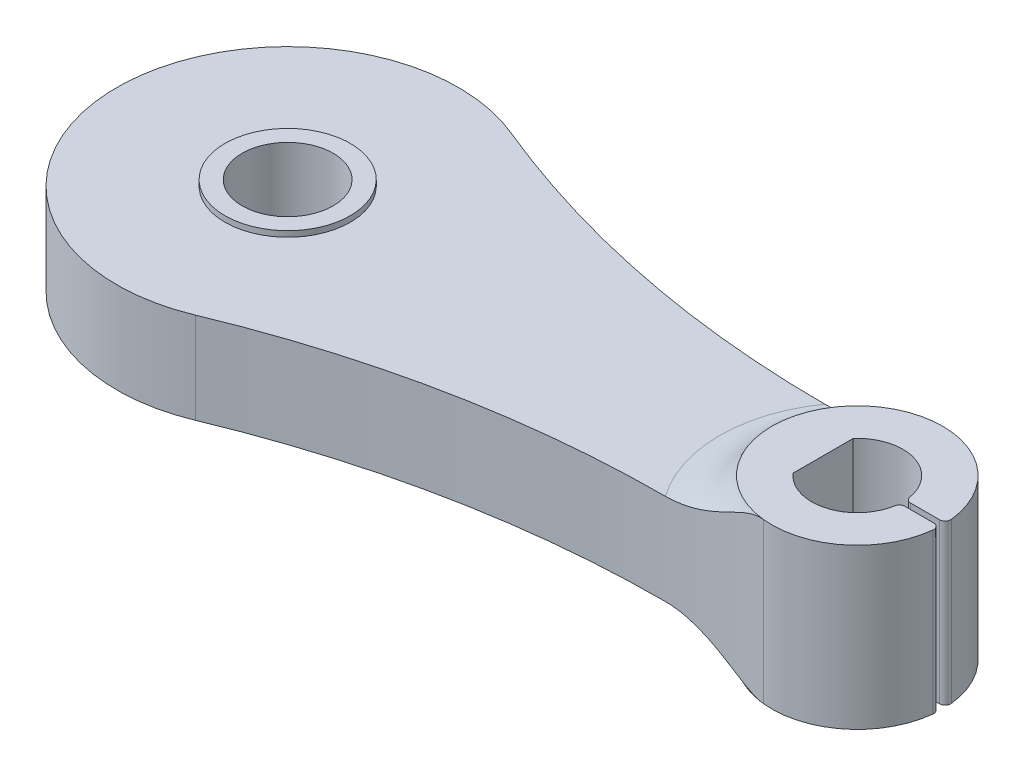
ISO-10303-21;
HEADER;
FILE_DESCRIPTION(('STEP AP214'),'2;1');
FILE_NAME('part.step','',(''),(''),'','','');
FILE_SCHEMA(('AUTOMOTIVE_DESIGN { 1 0 10303 214 1 1 1 1 }'));
ENDSEC;
DATA;
#1=APPLICATION_CONTEXT('core data for automotive mechanical design processes');
#2=APPLICATION_PROTOCOL_DEFINITION('international standard','automotive_design',2000,#1);
#3=PRODUCT_CONTEXT('',#1,'mechanical');
#4=PRODUCT('Part','Part','',(#3));
#5=PRODUCT_RELATED_PRODUCT_CATEGORY('part','',(#4));
#6=PRODUCT_DEFINITION_FORMATION('','',#4);
#7=PRODUCT_DEFINITION_CONTEXT('part definition',#1,'design');
#8=PRODUCT_DEFINITION('design','',#6,#7);
#9=PRODUCT_DEFINITION_SHAPE('','',#8);
#10=(LENGTH_UNIT() NAMED_UNIT(*) SI_UNIT(.MILLI.,.METRE.));
#11=(NAMED_UNIT(*) PLANE_ANGLE_UNIT() SI_UNIT($,.RADIAN.));
#12=(NAMED_UNIT(*) SI_UNIT($,.STERADIAN.) SOLID_ANGLE_UNIT());
#13=UNCERTAINTY_MEASURE_WITH_UNIT(LENGTH_MEASURE(1.E-05),#10,'distance_accuracy_value','');
#14=(GEOMETRIC_REPRESENTATION_CONTEXT(3) GLOBAL_UNCERTAINTY_ASSIGNED_CONTEXT((#13)) GLOBAL_UNIT_ASSIGNED_CONTEXT((#10,
#11,#12)) REPRESENTATION_CONTEXT('',''));
#15=CARTESIAN_POINT('',(0.,0.,0.));
#16=DIRECTION('',(0.,0.,1.));
#17=DIRECTION('',(1.,0.,0.));
#18=AXIS2_PLACEMENT_3D('',#15,#16,#17);
#19=CARTESIAN_POINT('',(50.,4.,0.));
#20=DIRECTION('',(0.,-1.,0.));
#21=DIRECTION('',(0.,0.,-1.));
#22=AXIS2_PLACEMENT_3D('',#19,#20,#21);
#23=CYLINDRICAL_SURFACE('',#22,7.5);
#24=CARTESIAN_POINT('',(50.,7.,0.));
#25=DIRECTION('',(0.,1.,0.));
#26=DIRECTION('',(0.,0.,1.));
#27=AXIS2_PLACEMENT_3D('',#24,#25,#26);
#28=CIRCLE('',#27,7.5);
#29=CARTESIAN_POINT('',(57.4568272716474,7.,-0.803571428571429));
#30=VERTEX_POINT('',#29);
#31=CARTESIAN_POINT('',(49.2404701433393,7.,-7.461441844365));
#32=VERTEX_POINT('',#31);
#33=EDGE_CURVE('E219',#30,#32,#28,.T.);
#34=ORIENTED_EDGE('',*,*,#33,.F.);
#35=DIRECTION('',(0.,-1.,0.));
#36=VECTOR('',#35,1.);
#37=CARTESIAN_POINT('',(57.4568272716474,4.,-0.803571428571429));
#38=LINE('',#37,#36);
#39=CARTESIAN_POINT('',(57.4568272716474,-7.,-0.803571428571429));
#40=VERTEX_POINT('',#39);
#41=EDGE_CURVE('E13',#30,#40,#38,.T.);
#42=ORIENTED_EDGE('',*,*,#41,.T.);
#43=CARTESIAN_POINT('',(50.,-7.,0.));
#44=DIRECTION('',(0.,1.,0.));
#45=DIRECTION('',(0.,0.,1.));
#46=AXIS2_PLACEMENT_3D('',#43,#44,#45);
#47=CIRCLE('',#46,7.5);
#48=CARTESIAN_POINT('',(49.2404701433393,-7.,-7.461441844365));
#49=VERTEX_POINT('',#48);
#50=EDGE_CURVE('E243',#49,#40,#47,.F.);
#51=ORIENTED_EDGE('',*,*,#50,.F.);
#52=DIRECTION('',(0.,-1.,0.));
#53=VECTOR('',#52,1.);
#54=CARTESIAN_POINT('',(49.2404701433393,4.,-7.461441844365));
#55=LINE('',#54,#53);
#56=EDGE_CURVE('E278',#32,#49,#55,.T.);
#57=ORIENTED_EDGE('',*,*,#56,.F.);
#58=EDGE_LOOP('',(#34,#42,#51,#57));
#59=FACE_BOUND('',#58,.T.);
#60=ADVANCED_FACE('F85',(#59),#23,.T.);
#61=CARTESIAN_POINT('',(50.,7.,0.));
#62=DIRECTION('',(0.,1.,0.));
#63=DIRECTION('',(0.,0.,1.));
#64=AXIS2_PLACEMENT_3D('',#61,#62,#63);
#65=PLANE('',#64);
#66=DIRECTION('',(1.,0.,0.));
#67=VECTOR('',#66,1.);
#68=CARTESIAN_POINT('',(53.1100169398287,7.,0.25));
#69=LINE('',#68,#67);
#70=CARTESIAN_POINT('',(54.4370598373247,7.,0.25));
#71=VERTEX_POINT('',#70);
#72=CARTESIAN_POINT('',(56.9597054535375,7.,0.25));
#73=VERTEX_POINT('',#72);
#74=EDGE_CURVE('E436',#71,#73,#69,.T.);
#75=ORIENTED_EDGE('',*,*,#74,.F.);
#76=CARTESIAN_POINT('',(54.4370598373247,7.,0.75));
#77=DIRECTION('',(0.,1.,0.));
#78=DIRECTION('',(0.,0.,1.));
#79=AXIS2_PLACEMENT_3D('',#76,#77,#78);
#80=CIRCLE('',#79,0.5);
#81=CARTESIAN_POINT('',(53.9440531887331,7.,0.666666666666667));
#82=VERTEX_POINT('',#81);
#83=EDGE_CURVE('E223',#71,#82,#80,.T.);
#84=ORIENTED_EDGE('',*,*,#83,.T.);
#85=CARTESIAN_POINT('',(50.,7.,0.));
#86=DIRECTION('',(0.,1.,0.));
#87=DIRECTION('',(0.,0.,1.));
#88=AXIS2_PLACEMENT_3D('',#85,#86,#87);
#89=CIRCLE('',#88,4.);
#90=CARTESIAN_POINT('',(47.,7.,2.64575131106458));
#91=VERTEX_POINT('',#90);
#92=EDGE_CURVE('E203',#91,#82,#89,.T.);
#93=ORIENTED_EDGE('',*,*,#92,.F.);
#94=DIRECTION('',(0.,0.,1.));
#95=VECTOR('',#94,1.);
#96=CARTESIAN_POINT('',(47.,7.,-2.64575131106458));
#97=LINE('',#96,#95);
#98=CARTESIAN_POINT('',(47.,7.,-2.64575131106458));
#99=VERTEX_POINT('',#98);
#100=EDGE_CURVE('E215',#99,#91,#97,.T.);
#101=ORIENTED_EDGE('',*,*,#100,.F.);
#102=CARTESIAN_POINT('',(53.9440531887331,7.,-0.666666666666667));
#103=VERTEX_POINT('',#102);
#104=EDGE_CURVE('E224',#103,#99,#89,.T.);
#105=ORIENTED_EDGE('',*,*,#104,.F.);
#106=CARTESIAN_POINT('',(54.4370598373247,7.,-0.75));
#107=DIRECTION('',(0.,1.,0.));
#108=DIRECTION('',(0.,0.,1.));
#109=AXIS2_PLACEMENT_3D('',#106,#107,#108);
#110=CIRCLE('',#109,0.5);
#111=CARTESIAN_POINT('',(54.4370598373247,7.,-0.25));
#112=VERTEX_POINT('',#111);
#113=EDGE_CURVE('E427',#103,#112,#110,.T.);
#114=ORIENTED_EDGE('',*,*,#113,.T.);
#115=DIRECTION('',(1.,0.,0.));
#116=VECTOR('',#115,1.);
#117=CARTESIAN_POINT('',(53.1100169398287,7.,-0.25));
#118=LINE('',#117,#116);
#119=CARTESIAN_POINT('',(56.9597054535375,7.,-0.25));
#120=VERTEX_POINT('',#119);
#121=EDGE_CURVE('E439',#112,#120,#118,.T.);
#122=ORIENTED_EDGE('',*,*,#121,.T.);
#123=CARTESIAN_POINT('',(56.9597054535375,7.,-0.75));
#124=DIRECTION('',(0.,1.,0.));
#125=DIRECTION('',(0.,0.,1.));
#126=AXIS2_PLACEMENT_3D('',#123,#124,#125);
#127=CIRCLE('',#126,0.5);
#128=EDGE_CURVE('E430',#120,#30,#127,.T.);
#129=ORIENTED_EDGE('',*,*,#128,.T.);
#130=ORIENTED_EDGE('',*,*,#33,.T.);
#131=CARTESIAN_POINT('',(49.2404701433393,7.,7.461441844365));
#132=VERTEX_POINT('',#131);
#133=EDGE_CURVE('E230',#32,#132,#28,.T.);
#134=ORIENTED_EDGE('',*,*,#133,.T.);
#135=CARTESIAN_POINT('',(57.4568272716474,7.,0.80357142857143));
#136=VERTEX_POINT('',#135);
#137=EDGE_CURVE('E234',#132,#136,#28,.T.);
#138=ORIENTED_EDGE('',*,*,#137,.T.);
#139=CARTESIAN_POINT('',(56.9597054535375,7.,0.75));
#140=DIRECTION('',(0.,1.,0.));
#141=DIRECTION('',(0.,0.,1.));
#142=AXIS2_PLACEMENT_3D('',#139,#140,#141);
#143=CIRCLE('',#142,0.5);
#144=EDGE_CURVE('E407',#136,#73,#143,.T.);
#145=ORIENTED_EDGE('',*,*,#144,.T.);
#146=EDGE_LOOP('',(#75,#84,#93,#101,#105,#114,#122,#129,#130,#134,#138,#145));
#147=FACE_BOUND('',#146,.T.);
#148=ADVANCED_FACE('F222',(#147),#65,.T.);
#149=CARTESIAN_POINT('',(0.,-7.,0.));
#150=DIRECTION('',(0.,1.,0.));
#151=DIRECTION('',(0.,0.,1.));
#152=AXIS2_PLACEMENT_3D('',#149,#150,#151);
#153=PLANE('',#152);
#154=CARTESIAN_POINT('',(50.,-7.,0.));
#155=DIRECTION('',(0.,1.,0.));
#156=DIRECTION('',(0.,0.,1.));
#157=AXIS2_PLACEMENT_3D('',#154,#155,#156);
#158=CIRCLE('',#157,4.);
#159=CARTESIAN_POINT('',(53.9440531887331,-7.,0.666666666666667));
#160=VERTEX_POINT('',#159);
#161=CARTESIAN_POINT('',(47.,-7.,2.64575131106458));
#162=VERTEX_POINT('',#161);
#163=EDGE_CURVE('E206',#160,#162,#158,.F.);
#164=ORIENTED_EDGE('',*,*,#163,.F.);
#165=CARTESIAN_POINT('',(54.4370598373247,-7.,0.75));
#166=DIRECTION('',(0.,1.,0.));
#167=DIRECTION('',(0.,0.,1.));
#168=AXIS2_PLACEMENT_3D('',#165,#166,#167);
#169=CIRCLE('',#168,0.5);
#170=CARTESIAN_POINT('',(54.4370598373247,-7.,0.25));
#171=VERTEX_POINT('',#170);
#172=EDGE_CURVE('E417',#160,#171,#169,.F.);
#173=ORIENTED_EDGE('',*,*,#172,.T.);
#174=DIRECTION('',(1.,0.,0.));
#175=VECTOR('',#174,1.);
#176=CARTESIAN_POINT('',(0.,-7.,0.25));
#177=LINE('',#176,#175);
#178=CARTESIAN_POINT('',(56.9597054535375,-7.,0.25));
#179=VERTEX_POINT('',#178);
#180=EDGE_CURVE('E435',#171,#179,#177,.T.);
#181=ORIENTED_EDGE('',*,*,#180,.T.);
#182=CARTESIAN_POINT('',(56.9597054535375,-7.,0.75));
#183=DIRECTION('',(0.,1.,0.));
#184=DIRECTION('',(0.,0.,1.));
#185=AXIS2_PLACEMENT_3D('',#182,#183,#184);
#186=CIRCLE('',#185,0.5);
#187=CARTESIAN_POINT('',(57.4568272716474,-7.,0.80357142857143));
#188=VERTEX_POINT('',#187);
#189=EDGE_CURVE('E106',#179,#188,#186,.F.);
#190=ORIENTED_EDGE('',*,*,#189,.T.);
#191=CARTESIAN_POINT('',(49.2404701433393,-7.,7.461441844365));
#192=VERTEX_POINT('',#191);
#193=EDGE_CURVE('E238',#188,#192,#47,.F.);
#194=ORIENTED_EDGE('',*,*,#193,.T.);
#195=EDGE_CURVE('E239',#192,#49,#47,.F.);
#196=ORIENTED_EDGE('',*,*,#195,.T.);
#197=ORIENTED_EDGE('',*,*,#50,.T.);
#198=CARTESIAN_POINT('',(56.9597054535375,-7.,-0.75));
#199=DIRECTION('',(0.,1.,0.));
#200=DIRECTION('',(0.,0.,1.));
#201=AXIS2_PLACEMENT_3D('',#198,#199,#200);
#202=CIRCLE('',#201,0.5);
#203=CARTESIAN_POINT('',(56.9597054535375,-7.,-0.25));
#204=VERTEX_POINT('',#203);
#205=EDGE_CURVE('E422',#40,#204,#202,.F.);
#206=ORIENTED_EDGE('',*,*,#205,.T.);
#207=DIRECTION('',(1.,0.,0.));
#208=VECTOR('',#207,1.);
#209=CARTESIAN_POINT('',(0.,-7.,-0.25));
#210=LINE('',#209,#208);
#211=CARTESIAN_POINT('',(54.4370598373247,-7.,-0.25));
#212=VERTEX_POINT('',#211);
#213=EDGE_CURVE('E226',#212,#204,#210,.T.);
#214=ORIENTED_EDGE('',*,*,#213,.F.);
#215=CARTESIAN_POINT('',(54.4370598373247,-7.,-0.75));
#216=DIRECTION('',(0.,1.,0.));
#217=DIRECTION('',(0.,0.,1.));
#218=AXIS2_PLACEMENT_3D('',#215,#216,#217);
#219=CIRCLE('',#218,0.5);
#220=CARTESIAN_POINT('',(53.9440531887331,-7.,-0.666666666666667));
#221=VERTEX_POINT('',#220);
#222=EDGE_CURVE('E419',#212,#221,#219,.F.);
#223=ORIENTED_EDGE('',*,*,#222,.T.);
#224=CARTESIAN_POINT('',(47.,-7.,-2.64575131106458));
#225=VERTEX_POINT('',#224);
#226=EDGE_CURVE('E235',#225,#221,#158,.F.);
#227=ORIENTED_EDGE('',*,*,#226,.F.);
#228=DIRECTION('',(0.,0.,-1.));
#229=VECTOR('',#228,1.);
#230=CARTESIAN_POINT('',(47.,-7.,-2.64575131106458));
#231=LINE('',#230,#229);
#232=EDGE_CURVE('E233',#162,#225,#231,.T.);
#233=ORIENTED_EDGE('',*,*,#232,.F.);
#234=EDGE_LOOP('',(#164,#173,#181,#190,#194,#196,#197,#206,#214,#223,#227,#233));
#235=FACE_BOUND('',#234,.T.);
#236=ADVANCED_FACE('F376',(#235),#153,.F.);
#237=CARTESIAN_POINT('',(50.,4.,0.));
#238=DIRECTION('',(0.,-1.,0.));
#239=DIRECTION('',(0.,0.,-1.));
#240=AXIS2_PLACEMENT_3D('',#237,#238,#239);
#241=CYLINDRICAL_SURFACE('',#240,4.00000000000001);
#242=ORIENTED_EDGE('',*,*,#226,.T.);
#243=DIRECTION('',(0.,-1.,0.));
#244=VECTOR('',#243,1.);
#245=CARTESIAN_POINT('',(53.9440531887331,4.,-0.666666666666667));
#246=LINE('',#245,#244);
#247=EDGE_CURVE('E414',#221,#103,#246,.F.);
#248=ORIENTED_EDGE('',*,*,#247,.T.);
#249=ORIENTED_EDGE('',*,*,#104,.T.);
#250=DIRECTION('',(0.,-1.,0.));
#251=VECTOR('',#250,1.);
#252=CARTESIAN_POINT('',(47.,4.,-2.64575131106458));
#253=LINE('',#252,#251);
#254=EDGE_CURVE('E211',#99,#225,#253,.T.);
#255=ORIENTED_EDGE('',*,*,#254,.T.);
#256=EDGE_LOOP('',(#242,#248,#249,#255));
#257=FACE_BOUND('',#256,.T.);
#258=ADVANCED_FACE('F379',(#257),#241,.F.);
#259=CARTESIAN_POINT('',(40.1508533778099,4.,96.7556891853994));
#260=DIRECTION('',(0.,-1.,0.));
#261=DIRECTION('',(0.,0.,-1.));
#262=AXIS2_PLACEMENT_3D('',#259,#260,#261);
#263=CYLINDRICAL_SURFACE('',#262,89.7556891853994);
#264=CARTESIAN_POINT('',(40.1508533778099,-4.,96.7556891853994));
#265=DIRECTION('',(0.,1.,0.));
#266=DIRECTION('',(0.,0.,1.));
#267=AXIS2_PLACEMENT_3D('',#264,#265,#266);
#268=CIRCLE('',#267,89.7556891853994);
#269=CARTESIAN_POINT('',(5.74921329190292,-4.,13.8544774901188));
#270=VERTEX_POINT('',#269);
#271=CARTESIAN_POINT('',(40.1517191669877,-4.,7.00000000417574));
#272=VERTEX_POINT('',#271);
#273=EDGE_CURVE('E272',#270,#272,#268,.F.);
#274=ORIENTED_EDGE('',*,*,#273,.T.);
#275=CARTESIAN_POINT('',(40.1517191669877,-4.,7.00000000417574));
#276=CARTESIAN_POINT('',(40.3650739280543,-3.99998503275693,6.99999647142615));
#277=CARTESIAN_POINT('',(40.5782977550911,-4.00906843364892,7.00076461168083));
#278=CARTESIAN_POINT('',(41.0030923892395,-4.04381030799842,7.00379668554938));
#279=CARTESIAN_POINT('',(41.2146651256413,-4.06944503675984,7.00605847646331));
#280=CARTESIAN_POINT('',(41.6321886862055,-4.13517408905288,7.0119852020642));
#281=CARTESIAN_POINT('',(41.8381760920268,-4.17504289964192,7.01562830528915));
#282=CARTESIAN_POINT('',(42.2472408374918,-4.26773557172542,7.0242523230979));
#283=CARTESIAN_POINT('',(42.4503169771821,-4.32056462133828,7.02923377351217));
#284=CARTESIAN_POINT('',(42.9354776413249,-4.46153878780631,7.04275704664601));
#285=CARTESIAN_POINT('',(43.2159129079021,-4.55529152276407,7.0519218014944));
#286=CARTESIAN_POINT('',(43.769891201506,-4.76099989290752,7.07256237914839));
#287=CARTESIAN_POINT('',(44.0434326443113,-4.87295966885728,7.08403872781374));
#288=CARTESIAN_POINT('',(44.4505072988947,-5.05176511093903,7.10294014692083));
#289=CARTESIAN_POINT('',(44.5863546029285,-5.1135266603868,7.10956053678141));
#290=CARTESIAN_POINT('',(44.8566788620384,-5.23992240111426,7.12334419432614));
#291=CARTESIAN_POINT('',(44.9911558235828,-5.3045565788267,7.13050745944644));
#292=CARTESIAN_POINT('',(45.2589511078463,-5.43601550058074,7.14537136250217));
#293=CARTESIAN_POINT('',(45.3922697457493,-5.50283962350754,7.15307184875788));
#294=CARTESIAN_POINT('',(45.6581339424304,-5.63795589812568,7.16901979195326));
#295=CARTESIAN_POINT('',(45.7906794630253,-5.70624812155694,7.17726727566367));
#296=CARTESIAN_POINT('',(46.1116581745025,-5.87258996652346,7.19795191607988));
#297=CARTESIAN_POINT('',(46.2999073458346,-5.97095356887168,7.21068021829658));
#298=CARTESIAN_POINT('',(46.6773191715987,-6.16572942484526,7.23739604025662));
#299=CARTESIAN_POINT('',(46.866481689119,-6.26214196033846,7.25138337649531));
#300=CARTESIAN_POINT('',(47.1513283070787,-6.40097006138974,7.27336713174549));
#301=CARTESIAN_POINT('',(47.2457804375966,-6.44597868107352,7.28080539074634));
#302=CARTESIAN_POINT('',(47.4358112160235,-6.53346823427619,7.29607693498163));
#303=CARTESIAN_POINT('',(47.5313897156674,-6.57594949611798,7.30391016866054));
#304=CARTESIAN_POINT('',(47.7239107017401,-6.65728708031997,7.32000357366688));
#305=CARTESIAN_POINT('',(47.8208512735616,-6.6961479994534,7.32826318231673));
#306=CARTESIAN_POINT('',(48.0165052969247,-6.76895412849709,7.34525971761691));
#307=CARTESIAN_POINT('',(48.1152179996207,-6.8029013622599,7.35399644569702));
#308=CARTESIAN_POINT('',(48.297309022167,-6.85893311454157,7.37042283913619));
#309=CARTESIAN_POINT('',(48.3803725029214,-6.88205394162226,7.37803076775633));
#310=CARTESIAN_POINT('',(48.5477817432871,-6.92281742404677,7.39360325829335));
#311=CARTESIAN_POINT('',(48.6321269130575,-6.94046252377719,7.40156765925747));
#312=CARTESIAN_POINT('',(48.8033831549215,-6.96953700054271,7.41798731126782));
#313=CARTESIAN_POINT('',(48.8903133469269,-6.98085305952041,7.42644868623633));
#314=CARTESIAN_POINT('',(49.0649717206972,-6.99613632846145,7.44370785249643));
#315=CARTESIAN_POINT('',(49.1527012452191,-7.00008717455953,7.45250634867476));
#316=CARTESIAN_POINT('',(49.2404701433399,-6.99999999999805,7.46144184436505));
#317=B_SPLINE_CURVE_WITH_KNOTS('',3,(#275,#276,#277,#278,#279,#280,#281,#282,#283,#284,#285,
#286,#287,#288,#289,#290,#291,#292,#293,#294,#295,#296,#297,#298,#299,#300,#301,#302,#303,#304,
#305,#306,#307,#308,#309,#310,#311,#312,#313,#314,#315,#316),.UNSPECIFIED.,.F.,.F.,(4,2,2,2,2,2,
2,2,2,2,2,2,2,2,2,2,2,2,2,2,4),(0.,0.639679250589893,1.27844284402577,1.907505427642,
2.53682024364053,3.42347356971667,4.31032882701087,4.75842485064685,5.20651875817666,
5.65448665833767,6.10247649879717,6.74082449304405,7.37907959803649,7.69372968461154,
8.00833880610101,8.32254286092008,8.6366171306064,8.89613517007863,9.1555371924534,
9.41944605850914,9.68394057577045),.UNSPECIFIED.);
#318=EDGE_CURVE('E295',#272,#192,#317,.T.);
#319=ORIENTED_EDGE('',*,*,#318,.T.);
#320=DIRECTION('',(0.,-1.,0.));
#321=VECTOR('',#320,1.);
#322=CARTESIAN_POINT('',(49.2404701433393,4.,7.461441844365));
#323=LINE('',#322,#321);
#324=EDGE_CURVE('E280',#132,#192,#323,.T.);
#325=ORIENTED_EDGE('',*,*,#324,.F.);
#326=CARTESIAN_POINT('',(49.2404701433393,7.,7.461441844365));
#327=CARTESIAN_POINT('',(49.1768367899299,7.00002635516338,7.45496400064645));
#328=CARTESIAN_POINT('',(49.1132079905768,6.99796916109737,7.44855603445425));
#329=CARTESIAN_POINT('',(48.986233143627,6.98988800330691,7.435904948171));
#330=CARTESIAN_POINT('',(48.9228869188593,6.98386703488923,7.4296617073042));
#331=CARTESIAN_POINT('',(48.7970862798442,6.9681122212642,7.41739745336572));
#332=CARTESIAN_POINT('',(48.7346287291306,6.95840408036743,7.41137521139327));
#333=CARTESIAN_POINT('',(48.6103138845298,6.93560804057646,7.39951889573062));
#334=CARTESIAN_POINT('',(48.5484566965962,6.92251955597185,7.39368485484718));
#335=CARTESIAN_POINT('',(48.3649281806781,6.87899420267018,7.37656561330168));
#336=CARTESIAN_POINT('',(48.2442631993026,6.84415543639123,7.3655623819291));
#337=CARTESIAN_POINT('',(48.0653511732818,6.78535427825589,7.34960401849969));
#338=CARTESIAN_POINT('',(48.0060047087599,6.76464005202082,7.34437082207437));
#339=CARTESIAN_POINT('',(47.8879718213105,6.72137433246757,7.33407968624382));
#340=CARTESIAN_POINT('',(47.8292853348447,6.69882301776526,7.3290217298684));
#341=CARTESIAN_POINT('',(47.6569613356767,6.63002418402956,7.31433873200418));
#342=CARTESIAN_POINT('',(47.5441593771961,6.58164305739465,7.30494640615866));
#343=CARTESIAN_POINT('',(47.3202492549258,6.48099122364772,7.28672181887767));
#344=CARTESIAN_POINT('',(47.2091415910113,6.42871939440841,7.27788972038977));
#345=CARTESIAN_POINT('',(46.9879874623177,6.32165851956295,7.26071920274946));
#346=CARTESIAN_POINT('',(46.8779420818023,6.26686717576674,7.25238125086125));
#347=CARTESIAN_POINT('',(46.658529154905,6.15587308103594,7.23616066124733));
#348=CARTESIAN_POINT('',(46.5491616478406,6.09967024917078,7.2282780497154));
#349=CARTESIAN_POINT('',(46.2209372557653,5.92996340304524,7.20522244244228));
#350=CARTESIAN_POINT('',(46.0024725676333,5.81562036140222,7.19068154014266));
#351=CARTESIAN_POINT('',(45.5642073702101,5.58961106122677,7.16312555922151));
#352=CARTESIAN_POINT('',(45.3444076862145,5.47794332549786,7.15010962237219));
#353=CARTESIAN_POINT('',(44.9015201964554,5.26057752004962,7.12553729168293));
#354=CARTESIAN_POINT('',(44.6784296744955,5.15488477494529,7.113982188674));
#355=CARTESIAN_POINT('',(44.2280380833404,4.95247003105622,7.09236821950665));
#356=CARTESIAN_POINT('',(44.0007360285272,4.85575016482254,7.08230970869655));
#357=CARTESIAN_POINT('',(43.5418702400517,4.67415799852869,7.0637867955057));
#358=CARTESIAN_POINT('',(43.310315970033,4.58926232135691,7.05531923580595));
#359=CARTESIAN_POINT('',(42.8424411465387,4.43367955112755,7.04006159218146));
#360=CARTESIAN_POINT('',(42.6061220735081,4.36298811738344,7.03327099564643));
#361=CARTESIAN_POINT('',(42.1891531675092,4.25405116410887,7.0229697533448));
#362=CARTESIAN_POINT('',(42.0094766081108,4.21211819829736,7.01906377819895));
#363=CARTESIAN_POINT('',(41.6480048043918,4.13869380839434,7.01230528503545));
#364=CARTESIAN_POINT('',(41.4662100463881,4.10720003463107,7.00945252994069));
#365=CARTESIAN_POINT('',(41.096262028406,4.05504620155602,7.00478401454));
#366=CARTESIAN_POINT('',(40.9080654122836,4.03468530217936,7.00299678276721));
#367=CARTESIAN_POINT('',(40.5305134191938,4.00715013330548,7.00060324155863));
#368=CARTESIAN_POINT('',(40.3411570225091,3.99998991485853,6.99999819041699));
#369=CARTESIAN_POINT('',(40.1517191669877,4.,7.00000000417573));
#370=B_SPLINE_CURVE_WITH_KNOTS('',3,(#326,#327,#328,#329,#330,#331,#332,#333,#334,#335,#336,
#337,#338,#339,#340,#341,#342,#343,#344,#345,#346,#347,#348,#349,#350,#351,#352,#353,#354,#355,
#356,#357,#358,#359,#360,#361,#362,#363,#364,#365,#366,#367,#368,#369),.UNSPECIFIED.,.F.,.F.,(4,
2,2,2,2,2,2,2,2,2,2,2,2,2,2,2,2,2,2,2,2,4),(0.,0.191834809622049,0.383524821508155,
0.573902333311647,0.76431285388432,1.14199462085055,1.33120387878386,1.52039476224281,
1.88956579115715,2.25884370928761,2.62846542039942,2.99810837313607,3.73912555779263,
4.4797236851829,5.22097171724436,5.9623954700802,6.702331920521,7.44204190811849,
7.99540661774157,8.54864669034879,9.11610201838496,9.68416100846899),.UNSPECIFIED.);
#371=CARTESIAN_POINT('',(40.1517191669877,4.,7.00000000417574));
#372=VERTEX_POINT('',#371);
#373=EDGE_CURVE('E332',#132,#372,#370,.T.);
#374=ORIENTED_EDGE('',*,*,#373,.T.);
#375=CARTESIAN_POINT('',(40.1508533778099,4.,96.7556891853994));
#376=DIRECTION('',(0.,1.,0.));
#377=DIRECTION('',(0.,0.,1.));
#378=AXIS2_PLACEMENT_3D('',#375,#376,#377);
#379=CIRCLE('',#378,89.7556891853994);
#380=CARTESIAN_POINT('',(5.74921329190292,4.,13.8544774901188));
#381=VERTEX_POINT('',#380);
#382=EDGE_CURVE('E262',#381,#372,#379,.F.);
#383=ORIENTED_EDGE('',*,*,#382,.F.);
#384=DIRECTION('',(0.,-1.,0.));
#385=VECTOR('',#384,1.);
#386=CARTESIAN_POINT('',(5.74921329190292,4.,13.8544774901188));
#387=LINE('',#386,#385);
#388=EDGE_CURVE('E283',#381,#270,#387,.T.);
#389=ORIENTED_EDGE('',*,*,#388,.T.);
#390=EDGE_LOOP('',(#274,#319,#325,#374,#383,#389));
#391=FACE_BOUND('',#390,.T.);
#392=ADVANCED_FACE('F311',(#391),#263,.F.);
#393=CARTESIAN_POINT('',(40.1508533778099,4.,-96.7556891853994));
#394=DIRECTION('',(0.,-1.,0.));
#395=DIRECTION('',(0.,0.,-1.));
#396=AXIS2_PLACEMENT_3D('',#393,#394,#395);
#397=CYLINDRICAL_SURFACE('',#396,89.7556891853994);
#398=CARTESIAN_POINT('',(40.1508533778099,-4.,-96.7556891853994));
#399=DIRECTION('',(0.,1.,0.));
#400=DIRECTION('',(0.,0.,1.));
#401=AXIS2_PLACEMENT_3D('',#398,#399,#400);
#402=CIRCLE('',#401,89.7556891853994);
#403=CARTESIAN_POINT('',(5.74921329190292,-4.,-13.8544774901188));
#404=VERTEX_POINT('',#403);
#405=CARTESIAN_POINT('',(40.1517191669877,-4.,-7.00000000417574));
#406=VERTEX_POINT('',#405);
#407=EDGE_CURVE('E263',#404,#406,#402,.T.);
#408=ORIENTED_EDGE('',*,*,#407,.F.);
#409=DIRECTION('',(0.,-1.,0.));
#410=VECTOR('',#409,1.);
#411=CARTESIAN_POINT('',(5.74921329190292,4.,-13.8544774901188));
#412=LINE('',#411,#410);
#413=CARTESIAN_POINT('',(5.74921329190292,4.,-13.8544774901188));
#414=VERTEX_POINT('',#413);
#415=EDGE_CURVE('E269',#414,#404,#412,.T.);
#416=ORIENTED_EDGE('',*,*,#415,.F.);
#417=CARTESIAN_POINT('',(40.1508533778099,4.,-96.7556891853994));
#418=DIRECTION('',(0.,1.,0.));
#419=DIRECTION('',(0.,0.,1.));
#420=AXIS2_PLACEMENT_3D('',#417,#418,#419);
#421=CIRCLE('',#420,89.7556891853994);
#422=CARTESIAN_POINT('',(40.1517191669877,4.,-7.00000000417574));
#423=VERTEX_POINT('',#422);
#424=EDGE_CURVE('E266',#414,#423,#421,.T.);
#425=ORIENTED_EDGE('',*,*,#424,.T.);
#426=CARTESIAN_POINT('',(40.1517191669877,4.,-7.00000000417574));
#427=CARTESIAN_POINT('',(40.3650739280543,3.99998503275693,-6.99999647142615));
#428=CARTESIAN_POINT('',(40.5782977550911,4.00906843364892,-7.00076461168083));
#429=CARTESIAN_POINT('',(41.0030923892395,4.04381030799842,-7.00379668554938));
#430=CARTESIAN_POINT('',(41.2146651256413,4.06944503675984,-7.00605847646331));
#431=CARTESIAN_POINT('',(41.6321886862055,4.13517408905288,-7.0119852020642));
#432=CARTESIAN_POINT('',(41.8381760920268,4.17504289964192,-7.01562830528915));
#433=CARTESIAN_POINT('',(42.2472408374918,4.26773557172542,-7.0242523230979));
#434=CARTESIAN_POINT('',(42.4503169771821,4.32056462133828,-7.02923377351217));
#435=CARTESIAN_POINT('',(42.9354776413249,4.46153878780631,-7.04275704664601));
#436=CARTESIAN_POINT('',(43.2159129079021,4.55529152276407,-7.0519218014944));
#437=CARTESIAN_POINT('',(43.769891201506,4.76099989290752,-7.07256237914839));
#438=CARTESIAN_POINT('',(44.0434326443113,4.87295966885728,-7.08403872781374));
#439=CARTESIAN_POINT('',(44.4505072988947,5.05176511093903,-7.10294014692083));
#440=CARTESIAN_POINT('',(44.5863546029285,5.1135266603868,-7.10956053678141));
#441=CARTESIAN_POINT('',(44.8566788620384,5.23992240111426,-7.12334419432614));
#442=CARTESIAN_POINT('',(44.9911558235828,5.3045565788267,-7.13050745944644));
#443=CARTESIAN_POINT('',(45.2589511078463,5.43601550058074,-7.14537136250217));
#444=CARTESIAN_POINT('',(45.3922697457493,5.50283962350754,-7.15307184875788));
#445=CARTESIAN_POINT('',(45.6581339424304,5.63795589812568,-7.16901979195326));
#446=CARTESIAN_POINT('',(45.7906794630253,5.70624812155694,-7.17726727566367));
#447=CARTESIAN_POINT('',(46.1116581745025,5.87258996652346,-7.19795191607987));
#448=CARTESIAN_POINT('',(46.2999073458346,5.97095356887169,-7.21068021829657));
#449=CARTESIAN_POINT('',(46.6773191715986,6.16572942484527,-7.23739604025661));
#450=CARTESIAN_POINT('',(46.866481689119,6.26214196033847,-7.25138337649531));
#451=CARTESIAN_POINT('',(47.1513283070787,6.40097006138974,-7.27336713174549));
#452=CARTESIAN_POINT('',(47.2457804375966,6.44597868107352,-7.28080539074634));
#453=CARTESIAN_POINT('',(47.4358112160235,6.53346823427618,-7.29607693498164));
#454=CARTESIAN_POINT('',(47.5313897156674,6.57594949611798,-7.30391016866054));
#455=CARTESIAN_POINT('',(47.7239107017401,6.65728708031997,-7.32000357366688));
#456=CARTESIAN_POINT('',(47.8208512735616,6.6961479994534,-7.32826318231673));
#457=CARTESIAN_POINT('',(48.0165052969247,6.76895412849709,-7.34525971761691));
#458=CARTESIAN_POINT('',(48.1152179996207,6.8029013622599,-7.35399644569702));
#459=CARTESIAN_POINT('',(48.297309022167,6.85893311454157,-7.37042283913619));
#460=CARTESIAN_POINT('',(48.3803725029214,6.88205394162226,-7.37803076775633));
#461=CARTESIAN_POINT('',(48.5477817432871,6.92281742404677,-7.39360325829335));
#462=CARTESIAN_POINT('',(48.6321269130575,6.94046252377719,-7.40156765925747));
#463=CARTESIAN_POINT('',(48.8033831549215,6.96953700054271,-7.41798731126782));
#464=CARTESIAN_POINT('',(48.8903133469269,6.98085305952041,-7.42644868623633));
#465=CARTESIAN_POINT('',(49.0649717206972,6.99613632846145,-7.44370785249643));
#466=CARTESIAN_POINT('',(49.1527012452191,7.00008717455953,-7.45250634867476));
#467=CARTESIAN_POINT('',(49.2404701433399,6.99999999999805,-7.46144184436505));
#468=B_SPLINE_CURVE_WITH_KNOTS('',3,(#426,#427,#428,#429,#430,#431,#432,#433,#434,#435,#436,
#437,#438,#439,#440,#441,#442,#443,#444,#445,#446,#447,#448,#449,#450,#451,#452,#453,#454,#455,
#456,#457,#458,#459,#460,#461,#462,#463,#464,#465,#466,#467),.UNSPECIFIED.,.F.,.F.,(4,2,2,2,2,2,
2,2,2,2,2,2,2,2,2,2,2,2,2,2,4),(0.,0.639679250589893,1.27844284402577,1.907505427642,
2.53682024364053,3.42347356971667,4.31032882701087,4.75842485064685,5.20651875817666,
5.65448665833767,6.10247649879717,6.74082449304404,7.37907959803649,7.69372968461154,
8.00833880610101,8.32254286092009,8.6366171306064,8.89613517007864,9.1555371924534,
9.41944605850914,9.68394057577045),.UNSPECIFIED.);
#469=EDGE_CURVE('E338',#423,#32,#468,.T.);
#470=ORIENTED_EDGE('',*,*,#469,.T.);
#471=ORIENTED_EDGE('',*,*,#56,.T.);
#472=CARTESIAN_POINT('',(49.2404701433393,-7.,-7.461441844365));
#473=CARTESIAN_POINT('',(49.1768367899299,-7.00002635516338,-7.45496400064645));
#474=CARTESIAN_POINT('',(49.1132079905768,-6.99796916109737,-7.44855603445425));
#475=CARTESIAN_POINT('',(48.986233143627,-6.98988800330691,-7.435904948171));
#476=CARTESIAN_POINT('',(48.9228869188593,-6.98386703488923,-7.4296617073042));
#477=CARTESIAN_POINT('',(48.7970862798442,-6.9681122212642,-7.41739745336572));
#478=CARTESIAN_POINT('',(48.7346287291306,-6.95840408036743,-7.41137521139327));
#479=CARTESIAN_POINT('',(48.6103138845298,-6.93560804057646,-7.39951889573062));
#480=CARTESIAN_POINT('',(48.5484566965962,-6.92251955597185,-7.39368485484718));
#481=CARTESIAN_POINT('',(48.3649281806781,-6.87899420267018,-7.37656561330168));
#482=CARTESIAN_POINT('',(48.2442631993026,-6.84415543639123,-7.3655623819291));
#483=CARTESIAN_POINT('',(48.0653511732818,-6.78535427825589,-7.34960401849969));
#484=CARTESIAN_POINT('',(48.0060047087599,-6.76464005202082,-7.34437082207437));
#485=CARTESIAN_POINT('',(47.8879718213105,-6.72137433246757,-7.33407968624382));
#486=CARTESIAN_POINT('',(47.8292853348447,-6.69882301776526,-7.3290217298684));
#487=CARTESIAN_POINT('',(47.6569613356767,-6.63002418402956,-7.31433873200418));
#488=CARTESIAN_POINT('',(47.5441593771961,-6.58164305739465,-7.30494640615866));
#489=CARTESIAN_POINT('',(47.3202492549258,-6.48099122364772,-7.28672181887767));
#490=CARTESIAN_POINT('',(47.2091415910113,-6.42871939440841,-7.27788972038977));
#491=CARTESIAN_POINT('',(46.9879874623177,-6.32165851956295,-7.26071920274946));
#492=CARTESIAN_POINT('',(46.8779420818023,-6.26686717576674,-7.25238125086125));
#493=CARTESIAN_POINT('',(46.658529154905,-6.15587308103594,-7.23616066124733));
#494=CARTESIAN_POINT('',(46.5491616478406,-6.09967024917078,-7.2282780497154));
#495=CARTESIAN_POINT('',(46.2209372557653,-5.92996340304524,-7.20522244244228));
#496=CARTESIAN_POINT('',(46.0024725676333,-5.81562036140222,-7.19068154014266));
#497=CARTESIAN_POINT('',(45.5642073702101,-5.58961106122677,-7.16312555922151));
#498=CARTESIAN_POINT('',(45.3444076862145,-5.47794332549786,-7.15010962237219));
#499=CARTESIAN_POINT('',(44.9015201964554,-5.26057752004962,-7.12553729168293));
#500=CARTESIAN_POINT('',(44.6784296744955,-5.15488477494529,-7.113982188674));
#501=CARTESIAN_POINT('',(44.2280380833404,-4.95247003105622,-7.09236821950665));
#502=CARTESIAN_POINT('',(44.0007360285272,-4.85575016482254,-7.08230970869655));
#503=CARTESIAN_POINT('',(43.5418702400517,-4.67415799852869,-7.0637867955057));
#504=CARTESIAN_POINT('',(43.310315970033,-4.58926232135691,-7.05531923580595));
#505=CARTESIAN_POINT('',(42.8424411465387,-4.43367955112755,-7.04006159218146));
#506=CARTESIAN_POINT('',(42.6061220735081,-4.36298811738344,-7.03327099564643));
#507=CARTESIAN_POINT('',(42.1891531675092,-4.25405116410887,-7.0229697533448));
#508=CARTESIAN_POINT('',(42.0094766081108,-4.21211819829736,-7.01906377819895));
#509=CARTESIAN_POINT('',(41.6480048043918,-4.13869380839434,-7.01230528503545));
#510=CARTESIAN_POINT('',(41.4662100463881,-4.10720003463107,-7.00945252994069));
#511=CARTESIAN_POINT('',(41.096262028406,-4.05504620155602,-7.00478401454));
#512=CARTESIAN_POINT('',(40.9080654122836,-4.03468530217936,-7.00299678276721));
#513=CARTESIAN_POINT('',(40.5305134191938,-4.00715013330548,-7.00060324155863));
#514=CARTESIAN_POINT('',(40.3411570225091,-3.99998991485853,-6.99999819041699));
#515=CARTESIAN_POINT('',(40.1517191669877,-4.,-7.00000000417573));
#516=B_SPLINE_CURVE_WITH_KNOTS('',3,(#472,#473,#474,#475,#476,#477,#478,#479,#480,#481,#482,
#483,#484,#485,#486,#487,#488,#489,#490,#491,#492,#493,#494,#495,#496,#497,#498,#499,#500,#501,
#502,#503,#504,#505,#506,#507,#508,#509,#510,#511,#512,#513,#514,#515),.UNSPECIFIED.,.F.,.F.,(4,
2,2,2,2,2,2,2,2,2,2,2,2,2,2,2,2,2,2,2,2,4),(0.,0.191834809622049,0.383524821508155,
0.573902333311647,0.76431285388432,1.14199462085055,1.33120387878386,1.52039476224281,
1.88956579115715,2.25884370928761,2.62846542039942,2.99810837313607,3.73912555779263,
4.4797236851829,5.22097171724436,5.9623954700802,6.702331920521,7.44204190811849,
7.99540661774157,8.54864669034879,9.11610201838496,9.68416100846899),.UNSPECIFIED.);
#517=EDGE_CURVE('E304',#49,#406,#516,.T.);
#518=ORIENTED_EDGE('',*,*,#517,.T.);
#519=EDGE_LOOP('',(#408,#416,#425,#470,#471,#518));
#520=FACE_BOUND('',#519,.T.);
#521=ADVANCED_FACE('F347',(#520),#397,.F.);
#522=CARTESIAN_POINT('',(0.,4.,0.));
#523=DIRECTION('',(0.,-1.,0.));
#524=DIRECTION('',(0.,0.,-1.));
#525=AXIS2_PLACEMENT_3D('',#522,#523,#524);
#526=CYLINDRICAL_SURFACE('',#525,15.);
#527=CARTESIAN_POINT('',(0.,-4.,0.));
#528=DIRECTION('',(0.,1.,0.));
#529=DIRECTION('',(0.,0.,1.));
#530=AXIS2_PLACEMENT_3D('',#527,#528,#529);
#531=CIRCLE('',#530,15.);
#532=EDGE_CURVE('E210',#404,#270,#531,.T.);
#533=ORIENTED_EDGE('',*,*,#532,.T.);
#534=ORIENTED_EDGE('',*,*,#388,.F.);
#535=CARTESIAN_POINT('',(0.,4.,0.));
#536=DIRECTION('',(0.,1.,0.));
#537=DIRECTION('',(0.,0.,1.));
#538=AXIS2_PLACEMENT_3D('',#535,#536,#537);
#539=CIRCLE('',#538,15.);
#540=EDGE_CURVE('E259',#414,#381,#539,.T.);
#541=ORIENTED_EDGE('',*,*,#540,.F.);
#542=ORIENTED_EDGE('',*,*,#415,.T.);
#543=EDGE_LOOP('',(#533,#534,#541,#542));
#544=FACE_BOUND('',#543,.T.);
#545=ADVANCED_FACE('F351',(#544),#526,.T.);
#546=CARTESIAN_POINT('',(0.,-4.,0.));
#547=DIRECTION('',(0.,1.,0.));
#548=DIRECTION('',(0.,0.,1.));
#549=AXIS2_PLACEMENT_3D('',#546,#547,#548);
#550=PLANE('',#549);
#551=CARTESIAN_POINT('',(0.,-4.,0.));
#552=DIRECTION('',(0.,1.,0.));
#553=DIRECTION('',(0.,0.,1.));
#554=AXIS2_PLACEMENT_3D('',#551,#552,#553);
#555=CIRCLE('',#554,5.5);
#556=CARTESIAN_POINT('',(0.,-4.,5.5));
#557=VERTEX_POINT('',#556);
#558=EDGE_CURVE('E256',#557,#557,#555,.T.);
#559=ORIENTED_EDGE('',*,*,#558,.T.);
#560=EDGE_LOOP('',(#559));
#561=FACE_BOUND('',#560,.T.);
#562=ORIENTED_EDGE('',*,*,#407,.T.);
#563=CARTESIAN_POINT('',(50.,-4.,0.));
#564=DIRECTION('',(0.,1.,0.));
#565=DIRECTION('',(0.,0.,1.));
#566=AXIS2_PLACEMENT_3D('',#563,#564,#565);
#567=CIRCLE('',#566,12.0825756949558);
#568=EDGE_CURVE('E290',#406,#272,#567,.T.);
#569=ORIENTED_EDGE('',*,*,#568,.T.);
#570=ORIENTED_EDGE('',*,*,#273,.F.);
#571=ORIENTED_EDGE('',*,*,#532,.F.);
#572=EDGE_LOOP('',(#562,#569,#570,#571));
#573=FACE_BOUND('',#572,.T.);
#574=ADVANCED_FACE('F353',(#561,#573),#550,.F.);
#575=CARTESIAN_POINT('',(0.,4.,0.));
#576=DIRECTION('',(0.,1.,0.));
#577=DIRECTION('',(0.,0.,1.));
#578=AXIS2_PLACEMENT_3D('',#575,#576,#577);
#579=PLANE('',#578);
#580=ORIENTED_EDGE('',*,*,#382,.T.);
#581=CARTESIAN_POINT('',(50.,4.,0.));
#582=DIRECTION('',(0.,1.,0.));
#583=DIRECTION('',(0.,0.,1.));
#584=AXIS2_PLACEMENT_3D('',#581,#582,#583);
#585=CIRCLE('',#584,12.0825756949558);
#586=EDGE_CURVE('E293',#372,#423,#585,.F.);
#587=ORIENTED_EDGE('',*,*,#586,.T.);
#588=ORIENTED_EDGE('',*,*,#424,.F.);
#589=ORIENTED_EDGE('',*,*,#540,.T.);
#590=EDGE_LOOP('',(#580,#587,#588,#589));
#591=FACE_BOUND('',#590,.T.);
#592=CARTESIAN_POINT('',(0.,4.,0.));
#593=DIRECTION('',(0.,1.,0.));
#594=DIRECTION('',(0.,0.,1.));
#595=AXIS2_PLACEMENT_3D('',#592,#593,#594);
#596=CIRCLE('',#595,5.5);
#597=CARTESIAN_POINT('',(0.,4.,5.5));
#598=VERTEX_POINT('',#597);
#599=EDGE_CURVE('E286',#598,#598,#596,.T.);
#600=ORIENTED_EDGE('',*,*,#599,.F.);
#601=EDGE_LOOP('',(#600));
#602=FACE_BOUND('',#601,.T.);
#603=ADVANCED_FACE('F357',(#591,#602),#579,.T.);
#604=ORIENTED_EDGE('',*,*,#193,.F.);
#605=DIRECTION('',(0.,-1.,0.));
#606=VECTOR('',#605,1.);
#607=CARTESIAN_POINT('',(57.4568272716474,4.,0.803571428571429));
#608=LINE('',#607,#606);
#609=EDGE_CURVE('E93',#188,#136,#608,.F.);
#610=ORIENTED_EDGE('',*,*,#609,.T.);
#611=ORIENTED_EDGE('',*,*,#137,.F.);
#612=ORIENTED_EDGE('',*,*,#324,.T.);
#613=EDGE_LOOP('',(#604,#610,#611,#612));
#614=FACE_BOUND('',#613,.T.);
#615=ADVANCED_FACE('F321',(#614),#23,.T.);
#616=CARTESIAN_POINT('',(0.,-20.5563491861041,0.));
#617=DIRECTION('',(0.,1.,0.));
#618=DIRECTION('',(0.,0.,1.));
#619=AXIS2_PLACEMENT_3D('',#616,#617,#618);
#620=CYLINDRICAL_SURFACE('',#619,5.5);
#621=ORIENTED_EDGE('',*,*,#599,.T.);
#622=EDGE_LOOP('',(#621));
#623=FACE_BOUND('',#622,.T.);
#624=CARTESIAN_POINT('',(0.,4.5,0.));
#625=DIRECTION('',(0.,1.,0.));
#626=DIRECTION('',(0.,0.,1.));
#627=AXIS2_PLACEMENT_3D('',#624,#625,#626);
#628=CIRCLE('',#627,5.5);
#629=CARTESIAN_POINT('',(0.,4.5,5.5));
#630=VERTEX_POINT('',#629);
#631=EDGE_CURVE('E247',#630,#630,#628,.T.);
#632=ORIENTED_EDGE('',*,*,#631,.F.);
#633=EDGE_LOOP('',(#632));
#634=FACE_BOUND('',#633,.T.);
#635=ADVANCED_FACE('F362',(#623,#634),#620,.T.);
#636=CARTESIAN_POINT('',(0.,4.5,0.));
#637=DIRECTION('',(0.,1.,0.));
#638=DIRECTION('',(0.,0.,1.));
#639=AXIS2_PLACEMENT_3D('',#636,#637,#638);
#640=PLANE('',#639);
#641=ORIENTED_EDGE('',*,*,#631,.T.);
#642=EDGE_LOOP('',(#641));
#643=FACE_BOUND('',#642,.T.);
#644=CARTESIAN_POINT('',(0.,4.5,0.));
#645=DIRECTION('',(0.,1.,0.));
#646=DIRECTION('',(0.,0.,1.));
#647=AXIS2_PLACEMENT_3D('',#644,#645,#646);
#648=CIRCLE('',#647,4.);
#649=CARTESIAN_POINT('',(0.,4.5,4.));
#650=VERTEX_POINT('',#649);
#651=EDGE_CURVE('E242',#650,#650,#648,.T.);
#652=ORIENTED_EDGE('',*,*,#651,.F.);
#653=EDGE_LOOP('',(#652));
#654=FACE_BOUND('',#653,.T.);
#655=ADVANCED_FACE('F365',(#643,#654),#640,.T.);
#656=CARTESIAN_POINT('',(0.,-4.5,0.));
#657=DIRECTION('',(0.,1.,0.));
#658=DIRECTION('',(0.,0.,1.));
#659=AXIS2_PLACEMENT_3D('',#656,#657,#658);
#660=CIRCLE('',#659,5.5);
#661=CARTESIAN_POINT('',(0.,-4.5,5.5));
#662=VERTEX_POINT('',#661);
#663=EDGE_CURVE('E250',#662,#662,#660,.F.);
#664=ORIENTED_EDGE('',*,*,#663,.F.);
#665=EDGE_LOOP('',(#664));
#666=FACE_BOUND('',#665,.T.);
#667=ORIENTED_EDGE('',*,*,#558,.F.);
#668=EDGE_LOOP('',(#667));
#669=FACE_BOUND('',#668,.T.);
#670=ADVANCED_FACE('F367',(#666,#669),#620,.T.);
#671=CARTESIAN_POINT('',(0.,-4.5,0.));
#672=DIRECTION('',(0.,1.,0.));
#673=DIRECTION('',(0.,0.,1.));
#674=AXIS2_PLACEMENT_3D('',#671,#672,#673);
#675=PLANE('',#674);
#676=ORIENTED_EDGE('',*,*,#663,.T.);
#677=EDGE_LOOP('',(#676));
#678=FACE_BOUND('',#677,.T.);
#679=CARTESIAN_POINT('',(0.,-4.5,0.));
#680=DIRECTION('',(0.,1.,0.));
#681=DIRECTION('',(0.,0.,1.));
#682=AXIS2_PLACEMENT_3D('',#679,#680,#681);
#683=CIRCLE('',#682,4.);
#684=CARTESIAN_POINT('',(0.,-4.5,4.));
#685=VERTEX_POINT('',#684);
#686=EDGE_CURVE('E253',#685,#685,#683,.F.);
#687=ORIENTED_EDGE('',*,*,#686,.F.);
#688=EDGE_LOOP('',(#687));
#689=FACE_BOUND('',#688,.T.);
#690=ADVANCED_FACE('F368',(#678,#689),#675,.F.);
#691=CARTESIAN_POINT('',(0.,4.,0.));
#692=DIRECTION('',(0.,-1.,0.));
#693=DIRECTION('',(0.,0.,-1.));
#694=AXIS2_PLACEMENT_3D('',#691,#692,#693);
#695=CYLINDRICAL_SURFACE('',#694,4.);
#696=ORIENTED_EDGE('',*,*,#651,.T.);
#697=EDGE_LOOP('',(#696));
#698=FACE_BOUND('',#697,.T.);
#699=ORIENTED_EDGE('',*,*,#686,.T.);
#700=EDGE_LOOP('',(#699));
#701=FACE_BOUND('',#700,.T.);
#702=ADVANCED_FACE('F371',(#698,#701),#695,.F.);
#703=ORIENTED_EDGE('',*,*,#92,.T.);
#704=DIRECTION('',(0.,-1.,0.));
#705=VECTOR('',#704,1.);
#706=CARTESIAN_POINT('',(53.9440531887331,4.,0.666666666666668));
#707=LINE('',#706,#705);
#708=EDGE_CURVE('E424',#82,#160,#707,.T.);
#709=ORIENTED_EDGE('',*,*,#708,.T.);
#710=ORIENTED_EDGE('',*,*,#163,.T.);
#711=DIRECTION('',(0.,-1.,0.));
#712=VECTOR('',#711,1.);
#713=CARTESIAN_POINT('',(47.,4.,2.64575131106458));
#714=LINE('',#713,#712);
#715=EDGE_CURVE('E199',#91,#162,#714,.T.);
#716=ORIENTED_EDGE('',*,*,#715,.F.);
#717=EDGE_LOOP('',(#703,#709,#710,#716));
#718=FACE_BOUND('',#717,.T.);
#719=ADVANCED_FACE('F201',(#718),#241,.F.);
#720=CARTESIAN_POINT('',(47.,4.,0.));
#721=DIRECTION('',(1.,0.,0.));
#722=DIRECTION('',(0.,0.,-1.));
#723=AXIS2_PLACEMENT_3D('',#720,#721,#722);
#724=PLANE('',#723);
#725=ORIENTED_EDGE('',*,*,#715,.T.);
#726=ORIENTED_EDGE('',*,*,#232,.T.);
#727=ORIENTED_EDGE('',*,*,#254,.F.);
#728=ORIENTED_EDGE('',*,*,#100,.T.);
#729=EDGE_LOOP('',(#725,#726,#727,#728));
#730=FACE_BOUND('',#729,.T.);
#731=ADVANCED_FACE('F216',(#730),#724,.T.);
#732=CARTESIAN_POINT('',(50.,-9.,0.));
#733=DIRECTION('',(0.,1.,0.));
#734=DIRECTION('',(0.,0.,1.));
#735=AXIS2_PLACEMENT_3D('',#732,#733,#734);
#736=TOROIDAL_SURFACE('',#735,12.0825756949558,5.);
#737=ORIENTED_EDGE('',*,*,#517,.F.);
#738=ORIENTED_EDGE('',*,*,#195,.F.);
#739=ORIENTED_EDGE('',*,*,#318,.F.);
#740=ORIENTED_EDGE('',*,*,#568,.F.);
#741=EDGE_LOOP('',(#737,#738,#739,#740));
#742=FACE_BOUND('',#741,.T.);
#743=ADVANCED_FACE('F314',(#742),#736,.F.);
#744=CARTESIAN_POINT('',(50.,9.,0.));
#745=DIRECTION('',(0.,1.,0.));
#746=DIRECTION('',(0.,0.,1.));
#747=AXIS2_PLACEMENT_3D('',#744,#745,#746);
#748=TOROIDAL_SURFACE('',#747,12.0825756949558,5.);
#749=ORIENTED_EDGE('',*,*,#469,.F.);
#750=ORIENTED_EDGE('',*,*,#586,.F.);
#751=ORIENTED_EDGE('',*,*,#373,.F.);
#752=ORIENTED_EDGE('',*,*,#133,.F.);
#753=EDGE_LOOP('',(#749,#750,#751,#752));
#754=FACE_BOUND('',#753,.T.);
#755=ADVANCED_FACE('F319',(#754),#748,.F.);
#756=CARTESIAN_POINT('',(53.1100169398287,-7.9451007459439,0.25));
#757=DIRECTION('',(0.,0.,1.));
#758=DIRECTION('',(1.,0.,0.));
#759=AXIS2_PLACEMENT_3D('',#756,#757,#758);
#760=PLANE('',#759);
#761=ORIENTED_EDGE('',*,*,#180,.F.);
#762=DIRECTION('',(0.,1.,0.));
#763=VECTOR('',#762,1.);
#764=CARTESIAN_POINT('',(54.4370598373247,7.,0.25));
#765=LINE('',#764,#763);
#766=EDGE_CURVE('E431',#171,#71,#765,.T.);
#767=ORIENTED_EDGE('',*,*,#766,.T.);
#768=ORIENTED_EDGE('',*,*,#74,.T.);
#769=DIRECTION('',(0.,-1.,0.));
#770=VECTOR('',#769,1.);
#771=CARTESIAN_POINT('',(56.9597054535375,-7.9451007459439,0.25));
#772=LINE('',#771,#770);
#773=EDGE_CURVE('E345',#73,#179,#772,.T.);
#774=ORIENTED_EDGE('',*,*,#773,.T.);
#775=EDGE_LOOP('',(#761,#767,#768,#774));
#776=FACE_BOUND('',#775,.T.);
#777=ADVANCED_FACE('F327',(#776),#760,.F.);
#778=CARTESIAN_POINT('',(53.1100169398287,-7.9451007459439,-0.25));
#779=DIRECTION('',(0.,0.,1.));
#780=DIRECTION('',(1.,0.,0.));
#781=AXIS2_PLACEMENT_3D('',#778,#779,#780);
#782=PLANE('',#781);
#783=ORIENTED_EDGE('',*,*,#121,.F.);
#784=DIRECTION('',(0.,-1.,0.));
#785=VECTOR('',#784,1.);
#786=CARTESIAN_POINT('',(54.4370598373247,-7.9451007459439,-0.25));
#787=LINE('',#786,#785);
#788=EDGE_CURVE('E408',#112,#212,#787,.T.);
#789=ORIENTED_EDGE('',*,*,#788,.T.);
#790=ORIENTED_EDGE('',*,*,#213,.T.);
#791=DIRECTION('',(0.,1.,0.));
#792=VECTOR('',#791,1.);
#793=CARTESIAN_POINT('',(56.9597054535375,7.,-0.25));
#794=LINE('',#793,#792);
#795=EDGE_CURVE('E409',#204,#120,#794,.T.);
#796=ORIENTED_EDGE('',*,*,#795,.T.);
#797=EDGE_LOOP('',(#783,#789,#790,#796));
#798=FACE_BOUND('',#797,.T.);
#799=ADVANCED_FACE('F382',(#798),#782,.T.);
#800=CARTESIAN_POINT('',(54.4370598373247,4.,0.75));
#801=DIRECTION('',(0.,-1.,0.));
#802=DIRECTION('',(0.,0.,-1.));
#803=AXIS2_PLACEMENT_3D('',#800,#801,#802);
#804=CYLINDRICAL_SURFACE('',#803,0.5);
#805=ORIENTED_EDGE('',*,*,#172,.F.);
#806=ORIENTED_EDGE('',*,*,#708,.F.);
#807=ORIENTED_EDGE('',*,*,#83,.F.);
#808=ORIENTED_EDGE('',*,*,#766,.F.);
#809=EDGE_LOOP('',(#805,#806,#807,#808));
#810=FACE_BOUND('',#809,.T.);
#811=ADVANCED_FACE('F329',(#810),#804,.T.);
#812=CARTESIAN_POINT('',(54.4370598373247,4.,-0.75));
#813=DIRECTION('',(0.,-1.,0.));
#814=DIRECTION('',(0.,0.,-1.));
#815=AXIS2_PLACEMENT_3D('',#812,#813,#814);
#816=CYLINDRICAL_SURFACE('',#815,0.5);
#817=ORIENTED_EDGE('',*,*,#222,.F.);
#818=ORIENTED_EDGE('',*,*,#788,.F.);
#819=ORIENTED_EDGE('',*,*,#113,.F.);
#820=ORIENTED_EDGE('',*,*,#247,.F.);
#821=EDGE_LOOP('',(#817,#818,#819,#820));
#822=FACE_BOUND('',#821,.T.);
#823=ADVANCED_FACE('F449',(#822),#816,.T.);
#824=CARTESIAN_POINT('',(56.9597054535375,4.,0.75));
#825=DIRECTION('',(0.,-1.,0.));
#826=DIRECTION('',(0.,0.,-1.));
#827=AXIS2_PLACEMENT_3D('',#824,#825,#826);
#828=CYLINDRICAL_SURFACE('',#827,0.5);
#829=ORIENTED_EDGE('',*,*,#189,.F.);
#830=ORIENTED_EDGE('',*,*,#773,.F.);
#831=ORIENTED_EDGE('',*,*,#144,.F.);
#832=ORIENTED_EDGE('',*,*,#609,.F.);
#833=EDGE_LOOP('',(#829,#830,#831,#832));
#834=FACE_BOUND('',#833,.T.);
#835=ADVANCED_FACE('F405',(#834),#828,.T.);
#836=CARTESIAN_POINT('',(56.9597054535375,4.,-0.75));
#837=DIRECTION('',(0.,-1.,0.));
#838=DIRECTION('',(0.,0.,-1.));
#839=AXIS2_PLACEMENT_3D('',#836,#837,#838);
#840=CYLINDRICAL_SURFACE('',#839,0.5);
#841=ORIENTED_EDGE('',*,*,#205,.F.);
#842=ORIENTED_EDGE('',*,*,#41,.F.);
#843=ORIENTED_EDGE('',*,*,#128,.F.);
#844=ORIENTED_EDGE('',*,*,#795,.F.);
#845=EDGE_LOOP('',(#841,#842,#843,#844));
#846=FACE_BOUND('',#845,.T.);
#847=ADVANCED_FACE('F87',(#846),#840,.T.);
#848=CLOSED_SHELL('',(#60,#148,#236,#258,#392,#521,#545,#574,#603,#615,#635,#655,#670,#690,#702,
#719,#731,#743,#755,#777,#799,#811,#823,#835,#847));
#849=MANIFOLD_SOLID_BREP('B2',#848);
#850=ADVANCED_BREP_SHAPE_REPRESENTATION('',(#18,#849),#14);
#851=SHAPE_DEFINITION_REPRESENTATION(#9,#850);
ENDSEC;
END-ISO-10303-21;
